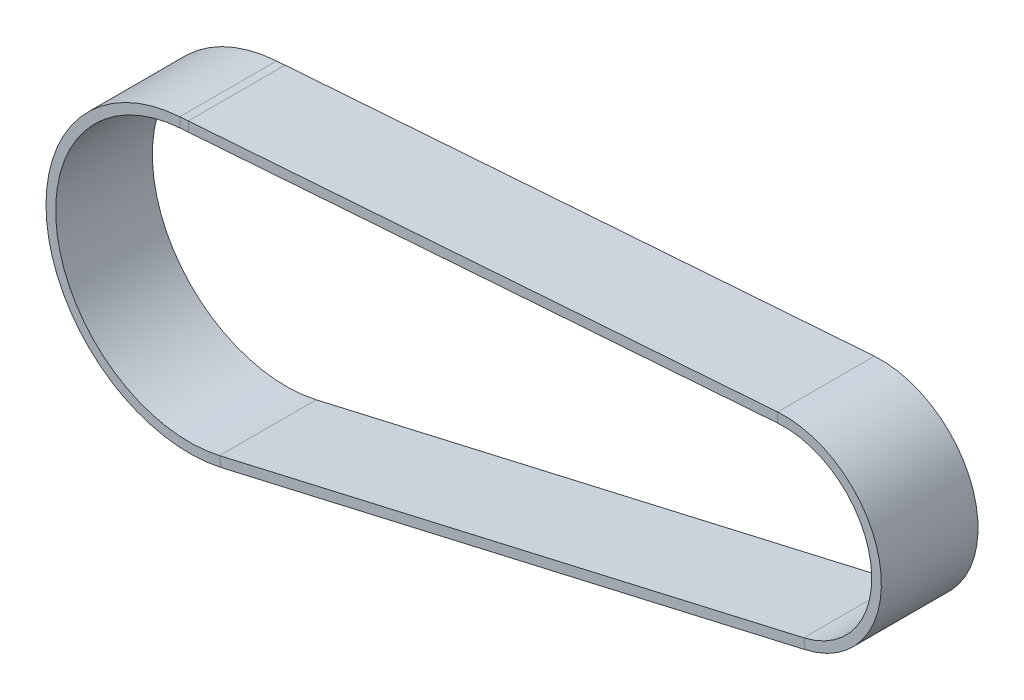
ISO-10303-21;
HEADER;
FILE_DESCRIPTION(('STEP AP214'),'2;1');
FILE_NAME('part.step','',(''),(''),'','','');
FILE_SCHEMA(('AUTOMOTIVE_DESIGN { 1 0 10303 214 1 1 1 1 }'));
ENDSEC;
DATA;
#1=APPLICATION_CONTEXT('core data for automotive mechanical design processes');
#2=APPLICATION_PROTOCOL_DEFINITION('international standard','automotive_design',2000,#1);
#3=PRODUCT_CONTEXT('',#1,'mechanical');
#4=PRODUCT('Part','Part','',(#3));
#5=PRODUCT_RELATED_PRODUCT_CATEGORY('part','',(#4));
#6=PRODUCT_DEFINITION_FORMATION('','',#4);
#7=PRODUCT_DEFINITION_CONTEXT('part definition',#1,'design');
#8=PRODUCT_DEFINITION('design','',#6,#7);
#9=PRODUCT_DEFINITION_SHAPE('','',#8);
#10=(LENGTH_UNIT() NAMED_UNIT(*) SI_UNIT(.MILLI.,.METRE.));
#11=(NAMED_UNIT(*) PLANE_ANGLE_UNIT() SI_UNIT($,.RADIAN.));
#12=(NAMED_UNIT(*) SI_UNIT($,.STERADIAN.) SOLID_ANGLE_UNIT());
#13=UNCERTAINTY_MEASURE_WITH_UNIT(LENGTH_MEASURE(1.E-05),#10,'distance_accuracy_value','');
#14=(GEOMETRIC_REPRESENTATION_CONTEXT(3) GLOBAL_UNCERTAINTY_ASSIGNED_CONTEXT((#13)) GLOBAL_UNIT_ASSIGNED_CONTEXT((#10,
#11,#12)) REPRESENTATION_CONTEXT('',''));
#15=CARTESIAN_POINT('',(0.,0.,0.));
#16=DIRECTION('',(0.,0.,1.));
#17=DIRECTION('',(1.,0.,0.));
#18=AXIS2_PLACEMENT_3D('',#15,#16,#17);
#19=CARTESIAN_POINT('',(60.9505921163115,17.0423265220565,5.));
#20=DIRECTION('',(0.,0.,-1.));
#21=DIRECTION('',(-1.,0.,0.));
#22=AXIS2_PLACEMENT_3D('',#19,#20,#21);
#23=PLANE('',#22);
#24=DIRECTION('',(0.,-1.,0.));
#25=VECTOR('',#24,1.);
#26=CARTESIAN_POINT('',(60.9505921163115,17.0423265220565,5.));
#27=LINE('',#26,#25);
#28=CARTESIAN_POINT('',(60.9505921163115,17.0423265220565,5.));
#29=VERTEX_POINT('',#28);
#30=CARTESIAN_POINT('',(60.9505921163115,16.0423265220565,5.));
#31=VERTEX_POINT('',#30);
#32=EDGE_CURVE('E177',#29,#31,#27,.T.);
#33=ORIENTED_EDGE('',*,*,#32,.F.);
#34=DIRECTION('',(-0.997388414860975,-0.0722243027042277,0.));
#35=VECTOR('',#34,1.);
#36=CARTESIAN_POINT('',(60.9505921163115,17.0423265220565,5.));
#37=LINE('',#36,#35);
#38=CARTESIAN_POINT('',(0.,12.6286859088116,5.));
#39=VERTEX_POINT('',#38);
#40=EDGE_CURVE('E175',#29,#39,#37,.T.);
#41=ORIENTED_EDGE('',*,*,#40,.T.);
#42=DIRECTION('',(0.,-1.,0.));
#43=VECTOR('',#42,1.);
#44=CARTESIAN_POINT('',(0.,12.6286859088116,5.));
#45=LINE('',#44,#43);
#46=CARTESIAN_POINT('',(0.,11.6286859088116,5.));
#47=VERTEX_POINT('',#46);
#48=EDGE_CURVE('E147',#39,#47,#45,.T.);
#49=ORIENTED_EDGE('',*,*,#48,.T.);
#50=DIRECTION('',(-0.997388414860975,-0.0722243027042277,0.));
#51=VECTOR('',#50,1.);
#52=CARTESIAN_POINT('',(60.9505921163115,16.0423265220565,5.));
#53=LINE('',#52,#51);
#54=EDGE_CURVE('E178',#31,#47,#53,.T.);
#55=ORIENTED_EDGE('',*,*,#54,.F.);
#56=EDGE_LOOP('',(#33,#41,#49,#55));
#57=FACE_BOUND('',#56,.T.);
#58=ADVANCED_FACE('F45',(#57),#23,.F.);
#59=CARTESIAN_POINT('',(0.,12.6286859088116,5.));
#60=DIRECTION('',(0.,0.,-1.));
#61=DIRECTION('',(-1.,0.,0.));
#62=AXIS2_PLACEMENT_3D('',#59,#60,#61);
#63=PLANE('',#62);
#64=DIRECTION('',(-0.997388414860975,-0.0722243027042277,0.));
#65=VECTOR('',#64,1.);
#66=CARTESIAN_POINT('',(0.,11.6286859088116,5.));
#67=LINE('',#66,#65);
#68=CARTESIAN_POINT('',(-0.881462424309942,11.5648562031451,5.));
#69=VERTEX_POINT('',#68);
#70=EDGE_CURVE('E156',#47,#69,#67,.T.);
#71=ORIENTED_EDGE('',*,*,#70,.F.);
#72=ORIENTED_EDGE('',*,*,#48,.F.);
#73=DIRECTION('',(-0.997388414860975,-0.0722243027042277,0.));
#74=VECTOR('',#73,1.);
#75=CARTESIAN_POINT('',(0.,12.6286859088116,5.));
#76=LINE('',#75,#74);
#77=CARTESIAN_POINT('',(-0.881462424309942,12.5648562031451,5.));
#78=VERTEX_POINT('',#77);
#79=EDGE_CURVE('E152',#39,#78,#76,.T.);
#80=ORIENTED_EDGE('',*,*,#79,.T.);
#81=DIRECTION('',(0.,-1.,0.));
#82=VECTOR('',#81,1.);
#83=CARTESIAN_POINT('',(-0.881462424309942,12.564856203145,5.));
#84=LINE('',#83,#82);
#85=EDGE_CURVE('E172',#78,#69,#84,.T.);
#86=ORIENTED_EDGE('',*,*,#85,.T.);
#87=EDGE_LOOP('',(#71,#72,#80,#86));
#88=FACE_BOUND('',#87,.T.);
#89=ADVANCED_FACE('F155',(#88),#63,.F.);
#90=CARTESIAN_POINT('',(0.,11.6286859088116,5.));
#91=DIRECTION('',(-0.0722243027042277,0.997388414860975,0.));
#92=DIRECTION('',(-0.997388414860975,-0.0722243027042277,0.));
#93=AXIS2_PLACEMENT_3D('',#90,#91,#92);
#94=PLANE('',#93);
#95=DIRECTION('',(-0.997388414860975,-0.0722243027042277,0.));
#96=VECTOR('',#95,1.);
#97=CARTESIAN_POINT('',(0.,11.6286859088116,-5.));
#98=LINE('',#97,#96);
#99=CARTESIAN_POINT('',(0.,11.6286859088116,-5.));
#100=VERTEX_POINT('',#99);
#101=CARTESIAN_POINT('',(-0.881462424309942,11.5648562031451,-5.));
#102=VERTEX_POINT('',#101);
#103=EDGE_CURVE('E222',#100,#102,#98,.T.);
#104=ORIENTED_EDGE('',*,*,#103,.F.);
#105=DIRECTION('',(0.,0.,-1.));
#106=VECTOR('',#105,1.);
#107=CARTESIAN_POINT('',(0.,11.6286859088116,5.));
#108=LINE('',#107,#106);
#109=EDGE_CURVE('E161',#47,#100,#108,.T.);
#110=ORIENTED_EDGE('',*,*,#109,.F.);
#111=ORIENTED_EDGE('',*,*,#70,.T.);
#112=DIRECTION('',(0.,0.,-1.));
#113=VECTOR('',#112,1.);
#114=CARTESIAN_POINT('',(-0.881462424309942,11.5648562031451,5.));
#115=LINE('',#114,#113);
#116=EDGE_CURVE('E248',#69,#102,#115,.T.);
#117=ORIENTED_EDGE('',*,*,#116,.T.);
#118=EDGE_LOOP('',(#104,#110,#111,#117));
#119=FACE_BOUND('',#118,.T.);
#120=ADVANCED_FACE('F266',(#119),#94,.F.);
#121=CARTESIAN_POINT('',(0.,12.6286859088116,-5.));
#122=DIRECTION('',(0.,0.,1.));
#123=DIRECTION('',(1.,0.,0.));
#124=AXIS2_PLACEMENT_3D('',#121,#122,#123);
#125=PLANE('',#124);
#126=DIRECTION('',(-0.997388414860975,-0.0722243027042277,0.));
#127=VECTOR('',#126,1.);
#128=CARTESIAN_POINT('',(0.,12.6286859088116,-5.));
#129=LINE('',#128,#127);
#130=CARTESIAN_POINT('',(0.,12.6286859088116,-5.));
#131=VERTEX_POINT('',#130);
#132=CARTESIAN_POINT('',(-0.881462424309942,12.5648562031451,-5.));
#133=VERTEX_POINT('',#132);
#134=EDGE_CURVE('E193',#131,#133,#129,.T.);
#135=ORIENTED_EDGE('',*,*,#134,.F.);
#136=DIRECTION('',(0.,1.,0.));
#137=VECTOR('',#136,1.);
#138=CARTESIAN_POINT('',(0.,12.6286859088116,-5.));
#139=LINE('',#138,#137);
#140=EDGE_CURVE('E181',#100,#131,#139,.T.);
#141=ORIENTED_EDGE('',*,*,#140,.F.);
#142=ORIENTED_EDGE('',*,*,#103,.T.);
#143=DIRECTION('',(0.,1.,0.));
#144=VECTOR('',#143,1.);
#145=CARTESIAN_POINT('',(-0.881462424309942,12.5648562031451,-5.));
#146=LINE('',#145,#144);
#147=EDGE_CURVE('E224',#102,#133,#146,.T.);
#148=ORIENTED_EDGE('',*,*,#147,.T.);
#149=EDGE_LOOP('',(#135,#141,#142,#148));
#150=FACE_BOUND('',#149,.T.);
#151=ADVANCED_FACE('F218',(#150),#125,.F.);
#152=CARTESIAN_POINT('',(0.,12.6286859088116,5.));
#153=DIRECTION('',(0.0722243027042277,-0.997388414860975,0.));
#154=DIRECTION('',(0.997388414860975,0.0722243027042277,0.));
#155=AXIS2_PLACEMENT_3D('',#152,#153,#154);
#156=PLANE('',#155);
#157=DIRECTION('',(0.,0.,1.));
#158=VECTOR('',#157,1.);
#159=CARTESIAN_POINT('',(-0.881462424309942,12.564856203145,5.));
#160=LINE('',#159,#158);
#161=EDGE_CURVE('E168',#133,#78,#160,.T.);
#162=ORIENTED_EDGE('',*,*,#161,.T.);
#163=ORIENTED_EDGE('',*,*,#79,.F.);
#164=DIRECTION('',(0.,0.,1.));
#165=VECTOR('',#164,1.);
#166=CARTESIAN_POINT('',(0.,12.6286859088116,5.));
#167=LINE('',#166,#165);
#168=EDGE_CURVE('E169',#131,#39,#167,.T.);
#169=ORIENTED_EDGE('',*,*,#168,.F.);
#170=ORIENTED_EDGE('',*,*,#134,.T.);
#171=EDGE_LOOP('',(#162,#163,#169,#170));
#172=FACE_BOUND('',#171,.T.);
#173=ADVANCED_FACE('F167',(#172),#156,.F.);
#174=CARTESIAN_POINT('',(-0.881462424309941,12.564856203145,5.));
#175=DIRECTION('',(0.,0.,-1.));
#176=DIRECTION('',(-1.,0.,0.));
#177=AXIS2_PLACEMENT_3D('',#174,#175,#176);
#178=PLANE('',#177);
#179=CARTESIAN_POINT('',(0.122816504800435,-2.23999999994202,5.));
#180=DIRECTION('',(0.,0.,1.));
#181=DIRECTION('',(-0.0725564932093471,0.997364304200407,0.));
#182=AXIS2_PLACEMENT_3D('',#179,#180,#181);
#183=CIRCLE('',#182,13.8413377588789);
#184=CARTESIAN_POINT('',(3.22930815661795,-15.7282297048571,5.));
#185=VERTEX_POINT('',#184);
#186=EDGE_CURVE('E135',#69,#185,#183,.T.);
#187=ORIENTED_EDGE('',*,*,#186,.F.);
#188=ORIENTED_EDGE('',*,*,#85,.F.);
#189=CARTESIAN_POINT('',(0.122816504800435,-2.23999999994202,5.));
#190=DIRECTION('',(0.,0.,1.));
#191=DIRECTION('',(-0.0676788926297377,0.997707155177516,0.));
#192=AXIS2_PLACEMENT_3D('',#189,#190,#191);
#193=CIRCLE('',#192,14.8388794510078);
#194=CARTESIAN_POINT('',(3.38244691204415,-16.7164344010545,5.));
#195=VERTEX_POINT('',#194);
#196=EDGE_CURVE('E190',#78,#195,#193,.T.);
#197=ORIENTED_EDGE('',*,*,#196,.T.);
#198=DIRECTION('',(-0.153138755426213,0.988204696197357,0.));
#199=VECTOR('',#198,1.);
#200=CARTESIAN_POINT('',(3.38244691204416,-16.7164344010545,5.));
#201=LINE('',#200,#199);
#202=EDGE_CURVE('E253',#195,#185,#201,.T.);
#203=ORIENTED_EDGE('',*,*,#202,.T.);
#204=EDGE_LOOP('',(#187,#188,#197,#203));
#205=FACE_BOUND('',#204,.T.);
#206=ADVANCED_FACE('F292',(#205),#178,.F.);
#207=CARTESIAN_POINT('',(0.122816504800435,-2.23999999994202,0.));
#208=DIRECTION('',(0.,0.,1.));
#209=DIRECTION('',(1.,0.,0.));
#210=AXIS2_PLACEMENT_3D('',#207,#208,#209);
#211=CYLINDRICAL_SURFACE('',#210,13.8413377588789);
#212=CARTESIAN_POINT('',(0.122816504800435,-2.23999999994202,-5.));
#213=DIRECTION('',(0.,0.,1.));
#214=DIRECTION('',(-0.0725564932093471,0.997364304200407,0.));
#215=AXIS2_PLACEMENT_3D('',#212,#213,#214);
#216=CIRCLE('',#215,13.8413377588789);
#217=CARTESIAN_POINT('',(3.22930815661795,-15.7282297048571,-5.));
#218=VERTEX_POINT('',#217);
#219=EDGE_CURVE('E129',#102,#218,#216,.T.);
#220=ORIENTED_EDGE('',*,*,#219,.F.);
#221=ORIENTED_EDGE('',*,*,#116,.F.);
#222=ORIENTED_EDGE('',*,*,#186,.T.);
#223=DIRECTION('',(0.,0.,-1.));
#224=VECTOR('',#223,1.);
#225=CARTESIAN_POINT('',(3.22930815661795,-15.7282297048571,5.));
#226=LINE('',#225,#224);
#227=EDGE_CURVE('E229',#185,#218,#226,.T.);
#228=ORIENTED_EDGE('',*,*,#227,.T.);
#229=EDGE_LOOP('',(#220,#221,#222,#228));
#230=FACE_BOUND('',#229,.T.);
#231=ADVANCED_FACE('F291',(#230),#211,.F.);
#232=CARTESIAN_POINT('',(-0.881462424309941,12.5648562031451,-5.));
#233=DIRECTION('',(0.,0.,1.));
#234=DIRECTION('',(1.,0.,0.));
#235=AXIS2_PLACEMENT_3D('',#232,#233,#234);
#236=PLANE('',#235);
#237=CARTESIAN_POINT('',(0.122816504800435,-2.23999999994202,-5.));
#238=DIRECTION('',(0.,0.,1.));
#239=DIRECTION('',(-0.0676788926297377,0.997707155177516,0.));
#240=AXIS2_PLACEMENT_3D('',#237,#238,#239);
#241=CIRCLE('',#240,14.8388794510078);
#242=CARTESIAN_POINT('',(3.38244691204416,-16.7164344010545,-5.));
#243=VERTEX_POINT('',#242);
#244=EDGE_CURVE('E192',#133,#243,#241,.T.);
#245=ORIENTED_EDGE('',*,*,#244,.F.);
#246=ORIENTED_EDGE('',*,*,#147,.F.);
#247=ORIENTED_EDGE('',*,*,#219,.T.);
#248=DIRECTION('',(0.153138755426213,-0.988204696197357,0.));
#249=VECTOR('',#248,1.);
#250=CARTESIAN_POINT('',(3.38244691204416,-16.7164344010545,-5.));
#251=LINE('',#250,#249);
#252=EDGE_CURVE('E227',#218,#243,#251,.T.);
#253=ORIENTED_EDGE('',*,*,#252,.T.);
#254=EDGE_LOOP('',(#245,#246,#247,#253));
#255=FACE_BOUND('',#254,.T.);
#256=ADVANCED_FACE('F298',(#255),#236,.F.);
#257=CARTESIAN_POINT('',(0.122816504800435,-2.23999999994202,0.));
#258=DIRECTION('',(0.,0.,1.));
#259=DIRECTION('',(1.,0.,0.));
#260=AXIS2_PLACEMENT_3D('',#257,#258,#259);
#261=CYLINDRICAL_SURFACE('',#260,14.8388794510078);
#262=DIRECTION('',(0.,0.,1.));
#263=VECTOR('',#262,1.);
#264=CARTESIAN_POINT('',(3.38244691204416,-16.7164344010545,5.));
#265=LINE('',#264,#263);
#266=EDGE_CURVE('E195',#243,#195,#265,.T.);
#267=ORIENTED_EDGE('',*,*,#266,.T.);
#268=ORIENTED_EDGE('',*,*,#196,.F.);
#269=ORIENTED_EDGE('',*,*,#161,.F.);
#270=ORIENTED_EDGE('',*,*,#244,.T.);
#271=EDGE_LOOP('',(#267,#268,#269,#270));
#272=FACE_BOUND('',#271,.T.);
#273=ADVANCED_FACE('F286',(#272),#261,.T.);
#274=CARTESIAN_POINT('',(3.38244691204415,-16.7164344010545,5.));
#275=DIRECTION('',(0.,0.,-1.));
#276=DIRECTION('',(-1.,0.,0.));
#277=AXIS2_PLACEMENT_3D('',#274,#275,#276);
#278=PLANE('',#277);
#279=DIRECTION('',(0.974563575670802,0.224111215640231,0.));
#280=VECTOR('',#279,1.);
#281=CARTESIAN_POINT('',(3.22930815661794,-15.7282297048572,5.));
#282=LINE('',#281,#280);
#283=CARTESIAN_POINT('',(63.6463605970953,-1.83468863082804,5.));
#284=VERTEX_POINT('',#283);
#285=EDGE_CURVE('E115',#185,#284,#282,.T.);
#286=ORIENTED_EDGE('',*,*,#285,.F.);
#287=ORIENTED_EDGE('',*,*,#202,.F.);
#288=DIRECTION('',(0.974563575670802,0.224111215640231,0.));
#289=VECTOR('',#288,1.);
#290=CARTESIAN_POINT('',(3.38244691204415,-16.7164344010545,5.));
#291=LINE('',#290,#289);
#292=CARTESIAN_POINT('',(63.7994993525215,-2.8228933270254,5.));
#293=VERTEX_POINT('',#292);
#294=EDGE_CURVE('E194',#195,#293,#291,.T.);
#295=ORIENTED_EDGE('',*,*,#294,.T.);
#296=DIRECTION('',(-0.153138755426214,0.988204696197357,0.));
#297=VECTOR('',#296,1.);
#298=CARTESIAN_POINT('',(63.7994993525215,-2.8228933270254,5.));
#299=LINE('',#298,#297);
#300=EDGE_CURVE('E204',#293,#284,#299,.T.);
#301=ORIENTED_EDGE('',*,*,#300,.T.);
#302=EDGE_LOOP('',(#286,#287,#295,#301));
#303=FACE_BOUND('',#302,.T.);
#304=ADVANCED_FACE('F285',(#303),#278,.F.);
#305=CARTESIAN_POINT('',(3.22930815661794,-15.7282297048572,5.));
#306=DIRECTION('',(0.224111215640231,-0.974563575670801,0.));
#307=DIRECTION('',(0.974563575670802,0.224111215640231,0.));
#308=AXIS2_PLACEMENT_3D('',#305,#306,#307);
#309=PLANE('',#308);
#310=DIRECTION('',(0.974563575670802,0.224111215640231,0.));
#311=VECTOR('',#310,1.);
#312=CARTESIAN_POINT('',(3.22930815661794,-15.7282297048572,-5.));
#313=LINE('',#312,#311);
#314=CARTESIAN_POINT('',(63.6463605970953,-1.83468863082804,-5.));
#315=VERTEX_POINT('',#314);
#316=EDGE_CURVE('E104',#218,#315,#313,.T.);
#317=ORIENTED_EDGE('',*,*,#316,.F.);
#318=ORIENTED_EDGE('',*,*,#227,.F.);
#319=ORIENTED_EDGE('',*,*,#285,.T.);
#320=DIRECTION('',(0.,0.,-1.));
#321=VECTOR('',#320,1.);
#322=CARTESIAN_POINT('',(63.6463605970953,-1.83468863082805,5.));
#323=LINE('',#322,#321);
#324=EDGE_CURVE('E205',#284,#315,#323,.T.);
#325=ORIENTED_EDGE('',*,*,#324,.T.);
#326=EDGE_LOOP('',(#317,#318,#319,#325));
#327=FACE_BOUND('',#326,.T.);
#328=ADVANCED_FACE('F290',(#327),#309,.F.);
#329=CARTESIAN_POINT('',(3.38244691204415,-16.7164344010545,-5.));
#330=DIRECTION('',(0.,0.,1.));
#331=DIRECTION('',(1.,0.,0.));
#332=AXIS2_PLACEMENT_3D('',#329,#330,#331);
#333=PLANE('',#332);
#334=DIRECTION('',(0.974563575670802,0.224111215640231,0.));
#335=VECTOR('',#334,1.);
#336=CARTESIAN_POINT('',(3.38244691204415,-16.7164344010545,-5.));
#337=LINE('',#336,#335);
#338=CARTESIAN_POINT('',(63.7994993525215,-2.8228933270254,-5.));
#339=VERTEX_POINT('',#338);
#340=EDGE_CURVE('E96',#243,#339,#337,.T.);
#341=ORIENTED_EDGE('',*,*,#340,.F.);
#342=ORIENTED_EDGE('',*,*,#252,.F.);
#343=ORIENTED_EDGE('',*,*,#316,.T.);
#344=DIRECTION('',(0.153138755426214,-0.988204696197357,0.));
#345=VECTOR('',#344,1.);
#346=CARTESIAN_POINT('',(63.7994993525215,-2.82289332702541,-5.));
#347=LINE('',#346,#345);
#348=EDGE_CURVE('E196',#315,#339,#347,.T.);
#349=ORIENTED_EDGE('',*,*,#348,.T.);
#350=EDGE_LOOP('',(#341,#342,#343,#349));
#351=FACE_BOUND('',#350,.T.);
#352=ADVANCED_FACE('F301',(#351),#333,.F.);
#353=CARTESIAN_POINT('',(3.38244691204415,-16.7164344010545,5.));
#354=DIRECTION('',(-0.224111215640231,0.974563575670801,0.));
#355=DIRECTION('',(-0.974563575670802,-0.224111215640231,0.));
#356=AXIS2_PLACEMENT_3D('',#353,#354,#355);
#357=PLANE('',#356);
#358=DIRECTION('',(0.,0.,1.));
#359=VECTOR('',#358,1.);
#360=CARTESIAN_POINT('',(63.7994993525215,-2.8228933270254,5.));
#361=LINE('',#360,#359);
#362=EDGE_CURVE('E198',#339,#293,#361,.T.);
#363=ORIENTED_EDGE('',*,*,#362,.T.);
#364=ORIENTED_EDGE('',*,*,#294,.F.);
#365=ORIENTED_EDGE('',*,*,#266,.F.);
#366=ORIENTED_EDGE('',*,*,#340,.T.);
#367=EDGE_LOOP('',(#363,#364,#365,#366));
#368=FACE_BOUND('',#367,.T.);
#369=ADVANCED_FACE('F283',(#368),#357,.F.);
#370=CARTESIAN_POINT('',(63.7994993525215,-2.8228933270254,5.));
#371=DIRECTION('',(0.,0.,-1.));
#372=DIRECTION('',(-1.,0.,0.));
#373=AXIS2_PLACEMENT_3D('',#370,#371,#372);
#374=PLANE('',#373);
#375=CARTESIAN_POINT('',(61.6099999999972,7.0000000000967,5.));
#376=DIRECTION('',(0.,0.,1.));
#377=DIRECTION('',(0.22460673322301,-0.974449493504352,0.));
#378=AXIS2_PLACEMENT_3D('',#375,#376,#377);
#379=CIRCLE('',#378,9.06633816305153);
#380=EDGE_CURVE('E237',#284,#31,#379,.T.);
#381=ORIENTED_EDGE('',*,*,#380,.F.);
#382=ORIENTED_EDGE('',*,*,#300,.F.);
#383=CARTESIAN_POINT('',(61.6099999999972,7.0000000000967,5.));
#384=DIRECTION('',(0.,0.,1.));
#385=DIRECTION('',(0.217558592788046,-0.976047262536034,0.));
#386=AXIS2_PLACEMENT_3D('',#383,#384,#385);
#387=CIRCLE('',#386,10.0639525401665);
#388=EDGE_CURVE('E197',#293,#29,#387,.T.);
#389=ORIENTED_EDGE('',*,*,#388,.T.);
#390=ORIENTED_EDGE('',*,*,#32,.T.);
#391=EDGE_LOOP('',(#381,#382,#389,#390));
#392=FACE_BOUND('',#391,.T.);
#393=ADVANCED_FACE('F281',(#392),#374,.F.);
#394=CARTESIAN_POINT('',(61.6099999999972,7.0000000000967,0.));
#395=DIRECTION('',(0.,0.,1.));
#396=DIRECTION('',(1.,0.,0.));
#397=AXIS2_PLACEMENT_3D('',#394,#395,#396);
#398=CYLINDRICAL_SURFACE('',#397,9.06633816305153);
#399=CARTESIAN_POINT('',(61.6099999999972,7.0000000000967,-5.));
#400=DIRECTION('',(0.,0.,1.));
#401=DIRECTION('',(0.22460673322301,-0.974449493504352,0.));
#402=AXIS2_PLACEMENT_3D('',#399,#400,#401);
#403=CIRCLE('',#402,9.06633816305153);
#404=CARTESIAN_POINT('',(60.9505921163115,16.0423265220565,-5.));
#405=VERTEX_POINT('',#404);
#406=EDGE_CURVE('E69',#315,#405,#403,.T.);
#407=ORIENTED_EDGE('',*,*,#406,.F.);
#408=ORIENTED_EDGE('',*,*,#324,.F.);
#409=ORIENTED_EDGE('',*,*,#380,.T.);
#410=DIRECTION('',(0.,0.,-1.));
#411=VECTOR('',#410,1.);
#412=CARTESIAN_POINT('',(60.9505921163115,16.0423265220565,5.));
#413=LINE('',#412,#411);
#414=EDGE_CURVE('E231',#31,#405,#413,.T.);
#415=ORIENTED_EDGE('',*,*,#414,.T.);
#416=EDGE_LOOP('',(#407,#408,#409,#415));
#417=FACE_BOUND('',#416,.T.);
#418=ADVANCED_FACE('F265',(#417),#398,.F.);
#419=CARTESIAN_POINT('',(63.7994993525215,-2.82289332702541,-5.));
#420=DIRECTION('',(0.,0.,1.));
#421=DIRECTION('',(1.,0.,0.));
#422=AXIS2_PLACEMENT_3D('',#419,#420,#421);
#423=PLANE('',#422);
#424=CARTESIAN_POINT('',(61.6099999999972,7.0000000000967,-5.));
#425=DIRECTION('',(0.,0.,1.));
#426=DIRECTION('',(0.217558592788046,-0.976047262536034,0.));
#427=AXIS2_PLACEMENT_3D('',#424,#425,#426);
#428=CIRCLE('',#427,10.0639525401665);
#429=CARTESIAN_POINT('',(60.9505921163115,17.0423265220565,-5.));
#430=VERTEX_POINT('',#429);
#431=EDGE_CURVE('E56',#339,#430,#428,.T.);
#432=ORIENTED_EDGE('',*,*,#431,.F.);
#433=ORIENTED_EDGE('',*,*,#348,.F.);
#434=ORIENTED_EDGE('',*,*,#406,.T.);
#435=DIRECTION('',(0.,1.,0.));
#436=VECTOR('',#435,1.);
#437=CARTESIAN_POINT('',(60.9505921163115,17.0423265220565,-5.));
#438=LINE('',#437,#436);
#439=EDGE_CURVE('E209',#405,#430,#438,.T.);
#440=ORIENTED_EDGE('',*,*,#439,.T.);
#441=EDGE_LOOP('',(#432,#433,#434,#440));
#442=FACE_BOUND('',#441,.T.);
#443=ADVANCED_FACE('F315',(#442),#423,.F.);
#444=CARTESIAN_POINT('',(61.6099999999972,7.0000000000967,0.));
#445=DIRECTION('',(0.,0.,1.));
#446=DIRECTION('',(1.,0.,0.));
#447=AXIS2_PLACEMENT_3D('',#444,#445,#446);
#448=CYLINDRICAL_SURFACE('',#447,10.0639525401665);
#449=DIRECTION('',(0.,0.,1.));
#450=VECTOR('',#449,1.);
#451=CARTESIAN_POINT('',(60.9505921163115,17.0423265220565,5.));
#452=LINE('',#451,#450);
#453=EDGE_CURVE('E46',#430,#29,#452,.T.);
#454=ORIENTED_EDGE('',*,*,#453,.T.);
#455=ORIENTED_EDGE('',*,*,#388,.F.);
#456=ORIENTED_EDGE('',*,*,#362,.F.);
#457=ORIENTED_EDGE('',*,*,#431,.T.);
#458=EDGE_LOOP('',(#454,#455,#456,#457));
#459=FACE_BOUND('',#458,.T.);
#460=ADVANCED_FACE('F211',(#459),#448,.T.);
#461=CARTESIAN_POINT('',(60.9505921163115,16.0423265220565,5.));
#462=DIRECTION('',(-0.0722243027042277,0.997388414860975,0.));
#463=DIRECTION('',(-0.997388414860975,-0.0722243027042277,0.));
#464=AXIS2_PLACEMENT_3D('',#461,#462,#463);
#465=PLANE('',#464);
#466=ORIENTED_EDGE('',*,*,#54,.T.);
#467=ORIENTED_EDGE('',*,*,#109,.T.);
#468=DIRECTION('',(-0.997388414860975,-0.0722243027042277,0.));
#469=VECTOR('',#468,1.);
#470=CARTESIAN_POINT('',(60.9505921163115,16.0423265220565,-5.));
#471=LINE('',#470,#469);
#472=EDGE_CURVE('E51',#405,#100,#471,.T.);
#473=ORIENTED_EDGE('',*,*,#472,.F.);
#474=ORIENTED_EDGE('',*,*,#414,.F.);
#475=EDGE_LOOP('',(#466,#467,#473,#474));
#476=FACE_BOUND('',#475,.T.);
#477=ADVANCED_FACE('F264',(#476),#465,.F.);
#478=CARTESIAN_POINT('',(60.9505921163115,17.0423265220565,-5.));
#479=DIRECTION('',(0.,0.,1.));
#480=DIRECTION('',(1.,0.,0.));
#481=AXIS2_PLACEMENT_3D('',#478,#479,#480);
#482=PLANE('',#481);
#483=ORIENTED_EDGE('',*,*,#472,.T.);
#484=ORIENTED_EDGE('',*,*,#140,.T.);
#485=DIRECTION('',(-0.997388414860975,-0.0722243027042277,0.));
#486=VECTOR('',#485,1.);
#487=CARTESIAN_POINT('',(60.9505921163115,17.0423265220565,-5.));
#488=LINE('',#487,#486);
#489=EDGE_CURVE('E11',#430,#131,#488,.T.);
#490=ORIENTED_EDGE('',*,*,#489,.F.);
#491=ORIENTED_EDGE('',*,*,#439,.F.);
#492=EDGE_LOOP('',(#483,#484,#490,#491));
#493=FACE_BOUND('',#492,.T.);
#494=ADVANCED_FACE('F214',(#493),#482,.F.);
#495=CARTESIAN_POINT('',(60.9505921163115,17.0423265220565,5.));
#496=DIRECTION('',(0.0722243027042277,-0.997388414860975,0.));
#497=DIRECTION('',(0.997388414860975,0.0722243027042277,0.));
#498=AXIS2_PLACEMENT_3D('',#495,#496,#497);
#499=PLANE('',#498);
#500=ORIENTED_EDGE('',*,*,#489,.T.);
#501=ORIENTED_EDGE('',*,*,#168,.T.);
#502=ORIENTED_EDGE('',*,*,#40,.F.);
#503=ORIENTED_EDGE('',*,*,#453,.F.);
#504=EDGE_LOOP('',(#500,#501,#502,#503));
#505=FACE_BOUND('',#504,.T.);
#506=ADVANCED_FACE('F42',(#505),#499,.F.);
#507=CLOSED_SHELL('',(#58,#89,#120,#151,#173,#206,#231,#256,#273,#304,#328,#352,#369,#393,#418,
#443,#460,#477,#494,#506));
#508=MANIFOLD_SOLID_BREP('B2',#507);
#509=ADVANCED_BREP_SHAPE_REPRESENTATION('',(#18,#508),#14);
#510=SHAPE_DEFINITION_REPRESENTATION(#9,#509);
ENDSEC;
END-ISO-10303-21;
